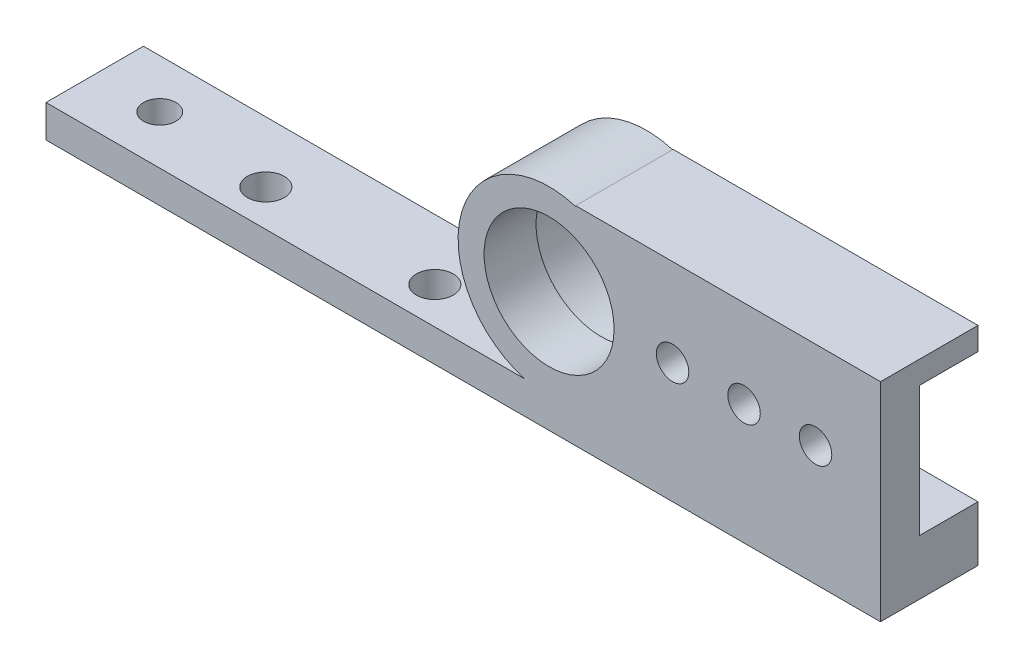
ISO-10303-21;
HEADER;
FILE_DESCRIPTION(('STEP AP214'),'2;1');
FILE_NAME('part.step','',(''),(''),'','','');
FILE_SCHEMA(('AUTOMOTIVE_DESIGN { 1 0 10303 214 1 1 1 1 }'));
ENDSEC;
DATA;
#1=APPLICATION_CONTEXT('core data for automotive mechanical design processes');
#2=APPLICATION_PROTOCOL_DEFINITION('international standard','automotive_design',2000,#1);
#3=PRODUCT_CONTEXT('',#1,'mechanical');
#4=PRODUCT('Part','Part','',(#3));
#5=PRODUCT_RELATED_PRODUCT_CATEGORY('part','',(#4));
#6=PRODUCT_DEFINITION_FORMATION('','',#4);
#7=PRODUCT_DEFINITION_CONTEXT('part definition',#1,'design');
#8=PRODUCT_DEFINITION('design','',#6,#7);
#9=PRODUCT_DEFINITION_SHAPE('','',#8);
#10=(LENGTH_UNIT() NAMED_UNIT(*) SI_UNIT(.MILLI.,.METRE.));
#11=(NAMED_UNIT(*) PLANE_ANGLE_UNIT() SI_UNIT($,.RADIAN.));
#12=(NAMED_UNIT(*) SI_UNIT($,.STERADIAN.) SOLID_ANGLE_UNIT());
#13=UNCERTAINTY_MEASURE_WITH_UNIT(LENGTH_MEASURE(1.E-05),#10,'distance_accuracy_value','');
#14=(GEOMETRIC_REPRESENTATION_CONTEXT(3) GLOBAL_UNCERTAINTY_ASSIGNED_CONTEXT((#13)) GLOBAL_UNIT_ASSIGNED_CONTEXT((#10,
#11,#12)) REPRESENTATION_CONTEXT('',''));
#15=CARTESIAN_POINT('',(0.,0.,0.));
#16=DIRECTION('',(0.,0.,1.));
#17=DIRECTION('',(1.,0.,0.));
#18=AXIS2_PLACEMENT_3D('',#15,#16,#17);
#19=CARTESIAN_POINT('',(-31.,0.,-9.));
#20=DIRECTION('',(0.,0.,1.));
#21=DIRECTION('',(1.,0.,0.));
#22=AXIS2_PLACEMENT_3D('',#19,#20,#21);
#23=CYLINDRICAL_SURFACE('',#22,14.);
#24=DIRECTION('',(0.,0.,1.));
#25=VECTOR('',#24,1.);
#26=CARTESIAN_POINT('',(-34.7080992435478,-13.5,-9.));
#27=LINE('',#26,#25);
#28=CARTESIAN_POINT('',(-34.7080992435478,-13.5,6.));
#29=VERTEX_POINT('',#28);
#30=CARTESIAN_POINT('',(-34.7080992435478,-13.5,-9.));
#31=VERTEX_POINT('',#30);
#32=EDGE_CURVE('E162',#29,#31,#27,.F.);
#33=ORIENTED_EDGE('',*,*,#32,.F.);
#34=CARTESIAN_POINT('',(-31.,0.,6.));
#35=DIRECTION('',(0.,0.,1.));
#36=DIRECTION('',(1.,0.,0.));
#37=AXIS2_PLACEMENT_3D('',#34,#35,#36);
#38=CIRCLE('',#37,14.);
#39=CARTESIAN_POINT('',(-26.8939671408107,13.3843376436512,6.));
#40=VERTEX_POINT('',#39);
#41=EDGE_CURVE('E181',#40,#29,#38,.T.);
#42=ORIENTED_EDGE('',*,*,#41,.F.);
#43=DIRECTION('',(0.,0.,1.));
#44=VECTOR('',#43,1.);
#45=CARTESIAN_POINT('',(-26.8939671408107,13.3843376436512,-9.));
#46=LINE('',#45,#44);
#47=CARTESIAN_POINT('',(-26.8939671408107,13.3843376436512,-9.));
#48=VERTEX_POINT('',#47);
#49=EDGE_CURVE('E226',#48,#40,#46,.T.);
#50=ORIENTED_EDGE('',*,*,#49,.F.);
#51=CARTESIAN_POINT('',(-31.,0.,-9.));
#52=DIRECTION('',(0.,0.,1.));
#53=DIRECTION('',(1.,0.,0.));
#54=AXIS2_PLACEMENT_3D('',#51,#52,#53);
#55=CIRCLE('',#54,14.);
#56=EDGE_CURVE('E197',#48,#31,#55,.T.);
#57=ORIENTED_EDGE('',*,*,#56,.T.);
#58=EDGE_LOOP('',(#33,#42,#50,#57));
#59=FACE_BOUND('',#58,.T.);
#60=ADVANCED_FACE('F45',(#59),#23,.T.);
#61=CARTESIAN_POINT('',(-31.,0.,-9.));
#62=DIRECTION('',(0.,0.,1.));
#63=DIRECTION('',(1.,0.,0.));
#64=AXIS2_PLACEMENT_3D('',#61,#62,#63);
#65=CYLINDRICAL_SURFACE('',#64,11.);
#66=CARTESIAN_POINT('',(-31.,0.,-9.));
#67=DIRECTION('',(0.,0.,1.));
#68=DIRECTION('',(1.,0.,0.));
#69=AXIS2_PLACEMENT_3D('',#66,#67,#68);
#70=CIRCLE('',#69,11.);
#71=CARTESIAN_POINT('',(-20.,0.,-9.));
#72=VERTEX_POINT('',#71);
#73=EDGE_CURVE('E177',#72,#72,#70,.T.);
#74=ORIENTED_EDGE('',*,*,#73,.F.);
#75=EDGE_LOOP('',(#74));
#76=FACE_BOUND('',#75,.T.);
#77=CARTESIAN_POINT('',(-31.,0.,-2.));
#78=DIRECTION('',(0.,0.,1.));
#79=DIRECTION('',(1.,0.,0.));
#80=AXIS2_PLACEMENT_3D('',#77,#78,#79);
#81=CIRCLE('',#80,11.);
#82=CARTESIAN_POINT('',(-20.,0.,-2.));
#83=VERTEX_POINT('',#82);
#84=EDGE_CURVE('E11',#83,#83,#81,.F.);
#85=ORIENTED_EDGE('',*,*,#84,.F.);
#86=EDGE_LOOP('',(#85));
#87=FACE_BOUND('',#86,.T.);
#88=ADVANCED_FACE('F323',(#76,#87),#65,.F.);
#89=CARTESIAN_POINT('',(20.,-10.,6.));
#90=DIRECTION('',(-1.,0.,0.));
#91=DIRECTION('',(0.,0.,1.));
#92=AXIS2_PLACEMENT_3D('',#89,#90,#91);
#93=PLANE('',#92);
#94=DIRECTION('',(0.,1.,0.));
#95=VECTOR('',#94,1.);
#96=CARTESIAN_POINT('',(20.,-10.,0.));
#97=LINE('',#96,#95);
#98=CARTESIAN_POINT('',(20.,-10.,0.));
#99=VERTEX_POINT('',#98);
#100=CARTESIAN_POINT('',(20.,10.,0.));
#101=VERTEX_POINT('',#100);
#102=EDGE_CURVE('E268',#99,#101,#97,.T.);
#103=ORIENTED_EDGE('',*,*,#102,.T.);
#104=DIRECTION('',(0.,0.,1.));
#105=VECTOR('',#104,1.);
#106=CARTESIAN_POINT('',(20.,10.,-9.));
#107=LINE('',#106,#105);
#108=CARTESIAN_POINT('',(20.,10.,-9.));
#109=VERTEX_POINT('',#108);
#110=EDGE_CURVE('E233',#109,#101,#107,.T.);
#111=ORIENTED_EDGE('',*,*,#110,.F.);
#112=DIRECTION('',(0.,-1.,0.));
#113=VECTOR('',#112,1.);
#114=CARTESIAN_POINT('',(20.,0.,-9.));
#115=LINE('',#114,#113);
#116=CARTESIAN_POINT('',(20.,13.5,-9.));
#117=VERTEX_POINT('',#116);
#118=EDGE_CURVE('E189',#117,#109,#115,.T.);
#119=ORIENTED_EDGE('',*,*,#118,.F.);
#120=DIRECTION('',(0.,0.,1.));
#121=VECTOR('',#120,1.);
#122=CARTESIAN_POINT('',(20.,13.5,-9.));
#123=LINE('',#122,#121);
#124=CARTESIAN_POINT('',(20.,13.5,6.));
#125=VERTEX_POINT('',#124);
#126=EDGE_CURVE('E230',#117,#125,#123,.T.);
#127=ORIENTED_EDGE('',*,*,#126,.T.);
#128=DIRECTION('',(0.,1.,0.));
#129=VECTOR('',#128,1.);
#130=CARTESIAN_POINT('',(20.,-10.,6.));
#131=LINE('',#130,#129);
#132=CARTESIAN_POINT('',(20.,-18.5,6.));
#133=VERTEX_POINT('',#132);
#134=EDGE_CURVE('E259',#133,#125,#131,.T.);
#135=ORIENTED_EDGE('',*,*,#134,.F.);
#136=DIRECTION('',(0.,0.,-1.));
#137=VECTOR('',#136,1.);
#138=CARTESIAN_POINT('',(20.,-18.5,-9.));
#139=LINE('',#138,#137);
#140=CARTESIAN_POINT('',(20.,-18.5,-9.));
#141=VERTEX_POINT('',#140);
#142=EDGE_CURVE('E155',#133,#141,#139,.T.);
#143=ORIENTED_EDGE('',*,*,#142,.T.);
#144=DIRECTION('',(0.,-1.,0.));
#145=VECTOR('',#144,1.);
#146=CARTESIAN_POINT('',(20.,0.,-9.));
#147=LINE('',#146,#145);
#148=CARTESIAN_POINT('',(20.,-10.,-9.));
#149=VERTEX_POINT('',#148);
#150=EDGE_CURVE('E200',#149,#141,#147,.T.);
#151=ORIENTED_EDGE('',*,*,#150,.F.);
#152=DIRECTION('',(0.,0.,1.));
#153=VECTOR('',#152,1.);
#154=CARTESIAN_POINT('',(20.,-10.,-9.));
#155=LINE('',#154,#153);
#156=EDGE_CURVE('E223',#149,#99,#155,.T.);
#157=ORIENTED_EDGE('',*,*,#156,.T.);
#158=EDGE_LOOP('',(#103,#111,#119,#127,#135,#143,#151,#157));
#159=FACE_BOUND('',#158,.T.);
#160=ADVANCED_FACE('F47',(#159),#93,.F.);
#161=CARTESIAN_POINT('',(0.,0.,6.));
#162=DIRECTION('',(0.,0.,1.));
#163=DIRECTION('',(1.,0.,0.));
#164=AXIS2_PLACEMENT_3D('',#161,#162,#163);
#165=PLANE('',#164);
#166=DIRECTION('',(0.,1.,0.));
#167=VECTOR('',#166,1.);
#168=CARTESIAN_POINT('',(-108.407697651309,0.,6.));
#169=LINE('',#168,#167);
#170=CARTESIAN_POINT('',(-108.407697651309,-18.5,5.99999999999999));
#171=VERTEX_POINT('',#170);
#172=CARTESIAN_POINT('',(-108.407697651309,-13.5,6.));
#173=VERTEX_POINT('',#172);
#174=EDGE_CURVE('E142',#171,#173,#169,.T.);
#175=ORIENTED_EDGE('',*,*,#174,.F.);
#176=DIRECTION('',(1.,0.,0.));
#177=VECTOR('',#176,1.);
#178=CARTESIAN_POINT('',(-180.,-18.5,6.));
#179=LINE('',#178,#177);
#180=EDGE_CURVE('E152',#171,#133,#179,.T.);
#181=ORIENTED_EDGE('',*,*,#180,.T.);
#182=ORIENTED_EDGE('',*,*,#134,.T.);
#183=DIRECTION('',(-1.,0.,0.));
#184=VECTOR('',#183,1.);
#185=CARTESIAN_POINT('',(0.,13.5,6.));
#186=LINE('',#185,#184);
#187=CARTESIAN_POINT('',(-26.8939671408107,13.5,6.));
#188=VERTEX_POINT('',#187);
#189=EDGE_CURVE('E174',#125,#188,#186,.T.);
#190=ORIENTED_EDGE('',*,*,#189,.T.);
#191=DIRECTION('',(0.,1.,0.));
#192=VECTOR('',#191,1.);
#193=CARTESIAN_POINT('',(-26.8939671408107,0.,6.));
#194=LINE('',#193,#192);
#195=EDGE_CURVE('E212',#40,#188,#194,.T.);
#196=ORIENTED_EDGE('',*,*,#195,.F.);
#197=ORIENTED_EDGE('',*,*,#41,.T.);
#198=DIRECTION('',(1.,0.,0.));
#199=VECTOR('',#198,1.);
#200=CARTESIAN_POINT('',(-180.,-13.5,6.));
#201=LINE('',#200,#199);
#202=EDGE_CURVE('E68',#173,#29,#201,.T.);
#203=ORIENTED_EDGE('',*,*,#202,.F.);
#204=EDGE_LOOP('',(#175,#181,#182,#190,#196,#197,#203));
#205=FACE_BOUND('',#204,.T.);
#206=CARTESIAN_POINT('',(10.,0.,6.));
#207=DIRECTION('',(0.,0.,1.));
#208=DIRECTION('',(1.,0.,0.));
#209=AXIS2_PLACEMENT_3D('',#206,#207,#208);
#210=CIRCLE('',#209,2.5);
#211=CARTESIAN_POINT('',(12.5,0.,6.));
#212=VERTEX_POINT('',#211);
#213=EDGE_CURVE('E245',#212,#212,#210,.T.);
#214=ORIENTED_EDGE('',*,*,#213,.F.);
#215=EDGE_LOOP('',(#214));
#216=FACE_BOUND('',#215,.T.);
#217=CARTESIAN_POINT('',(-0.999999999999999,0.,6.));
#218=DIRECTION('',(0.,0.,1.));
#219=DIRECTION('',(1.,0.,0.));
#220=AXIS2_PLACEMENT_3D('',#217,#218,#219);
#221=CIRCLE('',#220,2.5);
#222=CARTESIAN_POINT('',(1.5,0.,6.));
#223=VERTEX_POINT('',#222);
#224=EDGE_CURVE('E248',#223,#223,#221,.T.);
#225=ORIENTED_EDGE('',*,*,#224,.F.);
#226=EDGE_LOOP('',(#225));
#227=FACE_BOUND('',#226,.T.);
#228=CARTESIAN_POINT('',(-12.,-1.53625178909098E-13,6.));
#229=DIRECTION('',(0.,0.,1.));
#230=DIRECTION('',(1.,0.,0.));
#231=AXIS2_PLACEMENT_3D('',#228,#229,#230);
#232=CIRCLE('',#231,2.5);
#233=CARTESIAN_POINT('',(-9.5,-1.53625178909098E-13,6.));
#234=VERTEX_POINT('',#233);
#235=EDGE_CURVE('E254',#234,#234,#232,.T.);
#236=ORIENTED_EDGE('',*,*,#235,.F.);
#237=EDGE_LOOP('',(#236));
#238=FACE_BOUND('',#237,.T.);
#239=CARTESIAN_POINT('',(-31.,0.,6.));
#240=DIRECTION('',(0.,0.,1.));
#241=DIRECTION('',(1.,0.,0.));
#242=AXIS2_PLACEMENT_3D('',#239,#240,#241);
#243=CIRCLE('',#242,10.);
#244=CARTESIAN_POINT('',(-21.,0.,6.));
#245=VERTEX_POINT('',#244);
#246=EDGE_CURVE('E170',#245,#245,#243,.T.);
#247=ORIENTED_EDGE('',*,*,#246,.F.);
#248=EDGE_LOOP('',(#247));
#249=FACE_BOUND('',#248,.T.);
#250=ADVANCED_FACE('F150',(#205,#216,#227,#238,#249),#165,.T.);
#251=CARTESIAN_POINT('',(0.,0.,0.));
#252=DIRECTION('',(0.,0.,1.));
#253=DIRECTION('',(1.,0.,0.));
#254=AXIS2_PLACEMENT_3D('',#251,#252,#253);
#255=PLANE('',#254);
#256=CARTESIAN_POINT('',(10.,0.,0.));
#257=DIRECTION('',(0.,0.,1.));
#258=DIRECTION('',(1.,0.,0.));
#259=AXIS2_PLACEMENT_3D('',#256,#257,#258);
#260=CIRCLE('',#259,2.5);
#261=CARTESIAN_POINT('',(12.5,0.,0.));
#262=VERTEX_POINT('',#261);
#263=EDGE_CURVE('E241',#262,#262,#260,.T.);
#264=ORIENTED_EDGE('',*,*,#263,.T.);
#265=EDGE_LOOP('',(#264));
#266=FACE_BOUND('',#265,.T.);
#267=CARTESIAN_POINT('',(-0.999999999999999,0.,0.));
#268=DIRECTION('',(0.,0.,1.));
#269=DIRECTION('',(1.,0.,0.));
#270=AXIS2_PLACEMENT_3D('',#267,#268,#269);
#271=CIRCLE('',#270,2.5);
#272=CARTESIAN_POINT('',(1.5,0.,0.));
#273=VERTEX_POINT('',#272);
#274=EDGE_CURVE('E251',#273,#273,#271,.T.);
#275=ORIENTED_EDGE('',*,*,#274,.T.);
#276=EDGE_LOOP('',(#275));
#277=FACE_BOUND('',#276,.T.);
#278=CARTESIAN_POINT('',(-12.,-1.53625178909098E-13,0.));
#279=DIRECTION('',(0.,0.,1.));
#280=DIRECTION('',(1.,0.,0.));
#281=AXIS2_PLACEMENT_3D('',#278,#279,#280);
#282=CIRCLE('',#281,2.5);
#283=CARTESIAN_POINT('',(-9.5,-1.53625178909098E-13,0.));
#284=VERTEX_POINT('',#283);
#285=EDGE_CURVE('E219',#284,#284,#282,.T.);
#286=ORIENTED_EDGE('',*,*,#285,.T.);
#287=EDGE_LOOP('',(#286));
#288=FACE_BOUND('',#287,.T.);
#289=DIRECTION('',(0.,-1.,0.));
#290=VECTOR('',#289,1.);
#291=CARTESIAN_POINT('',(-20.,-10.,0.));
#292=LINE('',#291,#290);
#293=CARTESIAN_POINT('',(-20.,-8.66025403784439,0.));
#294=VERTEX_POINT('',#293);
#295=CARTESIAN_POINT('',(-20.,-10.,0.));
#296=VERTEX_POINT('',#295);
#297=EDGE_CURVE('E244',#294,#296,#292,.T.);
#298=ORIENTED_EDGE('',*,*,#297,.F.);
#299=CARTESIAN_POINT('',(-31.,0.,0.));
#300=DIRECTION('',(0.,0.,1.));
#301=DIRECTION('',(1.,0.,0.));
#302=AXIS2_PLACEMENT_3D('',#299,#300,#301);
#303=CIRCLE('',#302,14.);
#304=CARTESIAN_POINT('',(-20.,8.66025403784439,0.));
#305=VERTEX_POINT('',#304);
#306=EDGE_CURVE('E53',#294,#305,#303,.T.);
#307=ORIENTED_EDGE('',*,*,#306,.T.);
#308=CARTESIAN_POINT('',(-20.,10.,0.));
#309=VERTEX_POINT('',#308);
#310=EDGE_CURVE('E262',#309,#305,#292,.T.);
#311=ORIENTED_EDGE('',*,*,#310,.F.);
#312=DIRECTION('',(-1.,0.,0.));
#313=VECTOR('',#312,1.);
#314=CARTESIAN_POINT('',(20.,10.,0.));
#315=LINE('',#314,#313);
#316=EDGE_CURVE('E261',#101,#309,#315,.T.);
#317=ORIENTED_EDGE('',*,*,#316,.F.);
#318=ORIENTED_EDGE('',*,*,#102,.F.);
#319=DIRECTION('',(1.,0.,0.));
#320=VECTOR('',#319,1.);
#321=CARTESIAN_POINT('',(20.,-10.,0.));
#322=LINE('',#321,#320);
#323=EDGE_CURVE('E265',#296,#99,#322,.T.);
#324=ORIENTED_EDGE('',*,*,#323,.F.);
#325=EDGE_LOOP('',(#298,#307,#311,#317,#318,#324));
#326=FACE_BOUND('',#325,.T.);
#327=ADVANCED_FACE('F273',(#266,#277,#288,#326),#255,.F.);
#328=CARTESIAN_POINT('',(-12.,-1.53625178909098E-13,0.));
#329=DIRECTION('',(0.,0.,1.));
#330=DIRECTION('',(1.,0.,0.));
#331=AXIS2_PLACEMENT_3D('',#328,#329,#330);
#332=CYLINDRICAL_SURFACE('',#331,2.5);
#333=ORIENTED_EDGE('',*,*,#285,.F.);
#334=EDGE_LOOP('',(#333));
#335=FACE_BOUND('',#334,.T.);
#336=ORIENTED_EDGE('',*,*,#235,.T.);
#337=EDGE_LOOP('',(#336));
#338=FACE_BOUND('',#337,.T.);
#339=ADVANCED_FACE('F529',(#335,#338),#332,.F.);
#340=CARTESIAN_POINT('',(-0.999999999999999,0.,0.));
#341=DIRECTION('',(0.,0.,1.));
#342=DIRECTION('',(1.,0.,0.));
#343=AXIS2_PLACEMENT_3D('',#340,#341,#342);
#344=CYLINDRICAL_SURFACE('',#343,2.5);
#345=ORIENTED_EDGE('',*,*,#274,.F.);
#346=EDGE_LOOP('',(#345));
#347=FACE_BOUND('',#346,.T.);
#348=ORIENTED_EDGE('',*,*,#224,.T.);
#349=EDGE_LOOP('',(#348));
#350=FACE_BOUND('',#349,.T.);
#351=ADVANCED_FACE('F541',(#347,#350),#344,.F.);
#352=CARTESIAN_POINT('',(10.,0.,0.));
#353=DIRECTION('',(0.,0.,1.));
#354=DIRECTION('',(1.,0.,0.));
#355=AXIS2_PLACEMENT_3D('',#352,#353,#354);
#356=CYLINDRICAL_SURFACE('',#355,2.5);
#357=ORIENTED_EDGE('',*,*,#263,.F.);
#358=EDGE_LOOP('',(#357));
#359=FACE_BOUND('',#358,.T.);
#360=ORIENTED_EDGE('',*,*,#213,.T.);
#361=EDGE_LOOP('',(#360));
#362=FACE_BOUND('',#361,.T.);
#363=ADVANCED_FACE('F518',(#359,#362),#356,.F.);
#364=CARTESIAN_POINT('',(-31.,0.,-9.));
#365=DIRECTION('',(0.,0.,1.));
#366=DIRECTION('',(1.,0.,0.));
#367=AXIS2_PLACEMENT_3D('',#364,#365,#366);
#368=CYLINDRICAL_SURFACE('',#367,14.);
#369=ORIENTED_EDGE('',*,*,#306,.F.);
#370=DIRECTION('',(0.,0.,1.));
#371=VECTOR('',#370,1.);
#372=CARTESIAN_POINT('',(-20.,-8.66025403784439,-9.));
#373=LINE('',#372,#371);
#374=CARTESIAN_POINT('',(-20.,-8.66025403784439,-9.));
#375=VERTEX_POINT('',#374);
#376=EDGE_CURVE('E216',#375,#294,#373,.T.);
#377=ORIENTED_EDGE('',*,*,#376,.F.);
#378=CARTESIAN_POINT('',(-31.,0.,-9.));
#379=DIRECTION('',(0.,0.,1.));
#380=DIRECTION('',(1.,0.,0.));
#381=AXIS2_PLACEMENT_3D('',#378,#379,#380);
#382=CIRCLE('',#381,14.);
#383=CARTESIAN_POINT('',(-20.,8.66025403784439,-9.));
#384=VERTEX_POINT('',#383);
#385=EDGE_CURVE('E180',#375,#384,#382,.T.);
#386=ORIENTED_EDGE('',*,*,#385,.T.);
#387=DIRECTION('',(0.,0.,1.));
#388=VECTOR('',#387,1.);
#389=CARTESIAN_POINT('',(-20.,8.66025403784439,-9.));
#390=LINE('',#389,#388);
#391=EDGE_CURVE('E209',#384,#305,#390,.T.);
#392=ORIENTED_EDGE('',*,*,#391,.T.);
#393=EDGE_LOOP('',(#369,#377,#386,#392));
#394=FACE_BOUND('',#393,.T.);
#395=ADVANCED_FACE('F281',(#394),#368,.T.);
#396=CARTESIAN_POINT('',(-20.,0.,-9.));
#397=DIRECTION('',(-1.,0.,0.));
#398=DIRECTION('',(0.,0.,1.));
#399=AXIS2_PLACEMENT_3D('',#396,#397,#398);
#400=PLANE('',#399);
#401=ORIENTED_EDGE('',*,*,#376,.T.);
#402=ORIENTED_EDGE('',*,*,#297,.T.);
#403=DIRECTION('',(0.,0.,1.));
#404=VECTOR('',#403,1.);
#405=CARTESIAN_POINT('',(-20.,-10.,-9.));
#406=LINE('',#405,#404);
#407=CARTESIAN_POINT('',(-20.,-10.,-9.));
#408=VERTEX_POINT('',#407);
#409=EDGE_CURVE('E220',#408,#296,#406,.T.);
#410=ORIENTED_EDGE('',*,*,#409,.F.);
#411=DIRECTION('',(0.,-1.,0.));
#412=VECTOR('',#411,1.);
#413=CARTESIAN_POINT('',(-20.,0.,-9.));
#414=LINE('',#413,#412);
#415=EDGE_CURVE('E206',#375,#408,#414,.T.);
#416=ORIENTED_EDGE('',*,*,#415,.F.);
#417=EDGE_LOOP('',(#401,#402,#410,#416));
#418=FACE_BOUND('',#417,.T.);
#419=ADVANCED_FACE('F335',(#418),#400,.F.);
#420=CARTESIAN_POINT('',(0.,-10.,-9.));
#421=DIRECTION('',(0.,-1.,0.));
#422=DIRECTION('',(1.,0.,0.));
#423=AXIS2_PLACEMENT_3D('',#420,#421,#422);
#424=PLANE('',#423);
#425=ORIENTED_EDGE('',*,*,#409,.T.);
#426=ORIENTED_EDGE('',*,*,#323,.T.);
#427=ORIENTED_EDGE('',*,*,#156,.F.);
#428=DIRECTION('',(1.,0.,0.));
#429=VECTOR('',#428,1.);
#430=CARTESIAN_POINT('',(0.,-10.,-9.));
#431=LINE('',#430,#429);
#432=EDGE_CURVE('E203',#408,#149,#431,.T.);
#433=ORIENTED_EDGE('',*,*,#432,.F.);
#434=EDGE_LOOP('',(#425,#426,#427,#433));
#435=FACE_BOUND('',#434,.T.);
#436=ADVANCED_FACE('F295',(#435),#424,.F.);
#437=CARTESIAN_POINT('',(0.,10.,-9.));
#438=DIRECTION('',(0.,1.,0.));
#439=DIRECTION('',(-1.,0.,0.));
#440=AXIS2_PLACEMENT_3D('',#437,#438,#439);
#441=PLANE('',#440);
#442=ORIENTED_EDGE('',*,*,#110,.T.);
#443=ORIENTED_EDGE('',*,*,#316,.T.);
#444=DIRECTION('',(0.,0.,1.));
#445=VECTOR('',#444,1.);
#446=CARTESIAN_POINT('',(-20.,10.,-9.));
#447=LINE('',#446,#445);
#448=CARTESIAN_POINT('',(-20.,10.,-9.));
#449=VERTEX_POINT('',#448);
#450=EDGE_CURVE('E236',#449,#309,#447,.T.);
#451=ORIENTED_EDGE('',*,*,#450,.F.);
#452=DIRECTION('',(-1.,0.,0.));
#453=VECTOR('',#452,1.);
#454=CARTESIAN_POINT('',(0.,10.,-9.));
#455=LINE('',#454,#453);
#456=EDGE_CURVE('E186',#109,#449,#455,.T.);
#457=ORIENTED_EDGE('',*,*,#456,.F.);
#458=EDGE_LOOP('',(#442,#443,#451,#457));
#459=FACE_BOUND('',#458,.T.);
#460=ADVANCED_FACE('F291',(#459),#441,.F.);
#461=CARTESIAN_POINT('',(-20.,0.,-9.));
#462=DIRECTION('',(-1.,0.,0.));
#463=DIRECTION('',(0.,0.,1.));
#464=AXIS2_PLACEMENT_3D('',#461,#462,#463);
#465=PLANE('',#464);
#466=ORIENTED_EDGE('',*,*,#450,.T.);
#467=ORIENTED_EDGE('',*,*,#310,.T.);
#468=ORIENTED_EDGE('',*,*,#391,.F.);
#469=DIRECTION('',(0.,-1.,0.));
#470=VECTOR('',#469,1.);
#471=CARTESIAN_POINT('',(-20.,0.,-9.));
#472=LINE('',#471,#470);
#473=EDGE_CURVE('E184',#449,#384,#472,.T.);
#474=ORIENTED_EDGE('',*,*,#473,.F.);
#475=EDGE_LOOP('',(#466,#467,#468,#474));
#476=FACE_BOUND('',#475,.T.);
#477=ADVANCED_FACE('F279',(#476),#465,.F.);
#478=CARTESIAN_POINT('',(-26.8939671408107,0.,-9.));
#479=DIRECTION('',(1.,0.,0.));
#480=DIRECTION('',(0.,0.,-1.));
#481=AXIS2_PLACEMENT_3D('',#478,#479,#480);
#482=PLANE('',#481);
#483=ORIENTED_EDGE('',*,*,#195,.T.);
#484=DIRECTION('',(0.,0.,1.));
#485=VECTOR('',#484,1.);
#486=CARTESIAN_POINT('',(-26.8939671408107,13.5,-9.));
#487=LINE('',#486,#485);
#488=CARTESIAN_POINT('',(-26.8939671408107,13.5,-9.));
#489=VERTEX_POINT('',#488);
#490=EDGE_CURVE('E228',#489,#188,#487,.T.);
#491=ORIENTED_EDGE('',*,*,#490,.F.);
#492=DIRECTION('',(0.,1.,0.));
#493=VECTOR('',#492,1.);
#494=CARTESIAN_POINT('',(-26.8939671408107,0.,-9.));
#495=LINE('',#494,#493);
#496=EDGE_CURVE('E195',#48,#489,#495,.T.);
#497=ORIENTED_EDGE('',*,*,#496,.F.);
#498=ORIENTED_EDGE('',*,*,#49,.T.);
#499=EDGE_LOOP('',(#483,#491,#497,#498));
#500=FACE_BOUND('',#499,.T.);
#501=ADVANCED_FACE('F306',(#500),#482,.F.);
#502=CARTESIAN_POINT('',(0.,13.5,-9.));
#503=DIRECTION('',(0.,1.,0.));
#504=DIRECTION('',(-1.,0.,0.));
#505=AXIS2_PLACEMENT_3D('',#502,#503,#504);
#506=PLANE('',#505);
#507=ORIENTED_EDGE('',*,*,#189,.F.);
#508=ORIENTED_EDGE('',*,*,#126,.F.);
#509=DIRECTION('',(-1.,0.,0.));
#510=VECTOR('',#509,1.);
#511=CARTESIAN_POINT('',(0.,13.5,-9.));
#512=LINE('',#511,#510);
#513=EDGE_CURVE('E192',#117,#489,#512,.T.);
#514=ORIENTED_EDGE('',*,*,#513,.T.);
#515=ORIENTED_EDGE('',*,*,#490,.T.);
#516=EDGE_LOOP('',(#507,#508,#514,#515));
#517=FACE_BOUND('',#516,.T.);
#518=ADVANCED_FACE('F309',(#517),#506,.T.);
#519=CARTESIAN_POINT('',(0.,0.,-9.));
#520=DIRECTION('',(0.,0.,1.));
#521=DIRECTION('',(1.,0.,0.));
#522=AXIS2_PLACEMENT_3D('',#519,#520,#521);
#523=PLANE('',#522);
#524=ORIENTED_EDGE('',*,*,#73,.T.);
#525=EDGE_LOOP('',(#524));
#526=FACE_BOUND('',#525,.T.);
#527=DIRECTION('',(1.,0.,0.));
#528=VECTOR('',#527,1.);
#529=CARTESIAN_POINT('',(-180.,-18.5,-9.));
#530=LINE('',#529,#528);
#531=CARTESIAN_POINT('',(-108.407697651309,-18.5,-9.));
#532=VERTEX_POINT('',#531);
#533=EDGE_CURVE('E160',#532,#141,#530,.T.);
#534=ORIENTED_EDGE('',*,*,#533,.F.);
#535=DIRECTION('',(0.,1.,0.));
#536=VECTOR('',#535,1.);
#537=CARTESIAN_POINT('',(-108.407697651309,0.,-9.));
#538=LINE('',#537,#536);
#539=CARTESIAN_POINT('',(-108.407697651309,-13.5,-9.));
#540=VERTEX_POINT('',#539);
#541=EDGE_CURVE('E60',#532,#540,#538,.T.);
#542=ORIENTED_EDGE('',*,*,#541,.T.);
#543=DIRECTION('',(1.,0.,0.));
#544=VECTOR('',#543,1.);
#545=CARTESIAN_POINT('',(-180.,-13.5,-9.));
#546=LINE('',#545,#544);
#547=EDGE_CURVE('E164',#540,#31,#546,.T.);
#548=ORIENTED_EDGE('',*,*,#547,.T.);
#549=ORIENTED_EDGE('',*,*,#56,.F.);
#550=ORIENTED_EDGE('',*,*,#496,.T.);
#551=ORIENTED_EDGE('',*,*,#513,.F.);
#552=ORIENTED_EDGE('',*,*,#118,.T.);
#553=ORIENTED_EDGE('',*,*,#456,.T.);
#554=ORIENTED_EDGE('',*,*,#473,.T.);
#555=ORIENTED_EDGE('',*,*,#385,.F.);
#556=ORIENTED_EDGE('',*,*,#415,.T.);
#557=ORIENTED_EDGE('',*,*,#432,.T.);
#558=ORIENTED_EDGE('',*,*,#150,.T.);
#559=EDGE_LOOP('',(#534,#542,#548,#549,#550,#551,#552,#553,#554,#555,#556,#557,#558));
#560=FACE_BOUND('',#559,.T.);
#561=ADVANCED_FACE('F285',(#526,#560),#523,.F.);
#562=CARTESIAN_POINT('',(-31.,0.,-2.));
#563=DIRECTION('',(0.,0.,1.));
#564=DIRECTION('',(1.,0.,0.));
#565=AXIS2_PLACEMENT_3D('',#562,#563,#564);
#566=PLANE('',#565);
#567=CARTESIAN_POINT('',(-31.,0.,-2.));
#568=DIRECTION('',(0.,0.,1.));
#569=DIRECTION('',(1.,0.,0.));
#570=AXIS2_PLACEMENT_3D('',#567,#568,#569);
#571=CIRCLE('',#570,10.);
#572=CARTESIAN_POINT('',(-21.,0.,-2.));
#573=VERTEX_POINT('',#572);
#574=EDGE_CURVE('E171',#573,#573,#571,.T.);
#575=ORIENTED_EDGE('',*,*,#574,.T.);
#576=EDGE_LOOP('',(#575));
#577=FACE_BOUND('',#576,.T.);
#578=ORIENTED_EDGE('',*,*,#84,.T.);
#579=EDGE_LOOP('',(#578));
#580=FACE_BOUND('',#579,.T.);
#581=ADVANCED_FACE('F317',(#577,#580),#566,.F.);
#582=CARTESIAN_POINT('',(-31.,0.,-2.));
#583=DIRECTION('',(0.,0.,1.));
#584=DIRECTION('',(1.,0.,0.));
#585=AXIS2_PLACEMENT_3D('',#582,#583,#584);
#586=CYLINDRICAL_SURFACE('',#585,10.);
#587=ORIENTED_EDGE('',*,*,#574,.F.);
#588=EDGE_LOOP('',(#587));
#589=FACE_BOUND('',#588,.T.);
#590=ORIENTED_EDGE('',*,*,#246,.T.);
#591=EDGE_LOOP('',(#590));
#592=FACE_BOUND('',#591,.T.);
#593=ADVANCED_FACE('F340',(#589,#592),#586,.F.);
#594=CARTESIAN_POINT('',(-180.,-13.5,-9.));
#595=DIRECTION('',(0.,1.,0.));
#596=DIRECTION('',(0.,0.,1.));
#597=AXIS2_PLACEMENT_3D('',#594,#595,#596);
#598=PLANE('',#597);
#599=CARTESIAN_POINT('',(-54.236068439586,-13.5,0.343836832417843));
#600=DIRECTION('',(0.,1.,0.));
#601=DIRECTION('',(0.,0.,1.));
#602=AXIS2_PLACEMENT_3D('',#599,#600,#601);
#603=CIRCLE('',#602,2.83706985606989);
#604=CARTESIAN_POINT('',(-54.236068439586,-13.5,3.18090668848773));
#605=VERTEX_POINT('',#604);
#606=EDGE_CURVE('E369',#605,#605,#603,.T.);
#607=ORIENTED_EDGE('',*,*,#606,.F.);
#608=EDGE_LOOP('',(#607));
#609=FACE_BOUND('',#608,.T.);
#610=CARTESIAN_POINT('',(-80.236068439586,-13.5,0.343836832417843));
#611=DIRECTION('',(0.,1.,0.));
#612=DIRECTION('',(0.,0.,1.));
#613=AXIS2_PLACEMENT_3D('',#610,#611,#612);
#614=CIRCLE('',#613,2.83706985606989);
#615=CARTESIAN_POINT('',(-80.236068439586,-13.5,3.18090668848773));
#616=VERTEX_POINT('',#615);
#617=EDGE_CURVE('E373',#616,#616,#614,.T.);
#618=ORIENTED_EDGE('',*,*,#617,.F.);
#619=EDGE_LOOP('',(#618));
#620=FACE_BOUND('',#619,.T.);
#621=CARTESIAN_POINT('',(-98.407697651309,-13.5,-1.5));
#622=DIRECTION('',(0.,1.,0.));
#623=DIRECTION('',(0.,0.,1.));
#624=AXIS2_PLACEMENT_3D('',#621,#622,#623);
#625=CIRCLE('',#624,2.49999999999999);
#626=CARTESIAN_POINT('',(-98.407697651309,-13.5,0.99999999999999));
#627=VERTEX_POINT('',#626);
#628=EDGE_CURVE('E147',#627,#627,#625,.T.);
#629=ORIENTED_EDGE('',*,*,#628,.F.);
#630=EDGE_LOOP('',(#629));
#631=FACE_BOUND('',#630,.T.);
#632=DIRECTION('',(0.,0.,-1.));
#633=VECTOR('',#632,1.);
#634=CARTESIAN_POINT('',(-108.407697651309,-13.5,-9.));
#635=LINE('',#634,#633);
#636=EDGE_CURVE('E146',#173,#540,#635,.T.);
#637=ORIENTED_EDGE('',*,*,#636,.F.);
#638=ORIENTED_EDGE('',*,*,#202,.T.);
#639=ORIENTED_EDGE('',*,*,#32,.T.);
#640=ORIENTED_EDGE('',*,*,#547,.F.);
#641=EDGE_LOOP('',(#637,#638,#639,#640));
#642=FACE_BOUND('',#641,.T.);
#643=ADVANCED_FACE('F299',(#609,#620,#631,#642),#598,.T.);
#644=CARTESIAN_POINT('',(-180.,-18.5,-9.));
#645=DIRECTION('',(0.,-1.,0.));
#646=DIRECTION('',(0.,0.,-1.));
#647=AXIS2_PLACEMENT_3D('',#644,#645,#646);
#648=PLANE('',#647);
#649=CARTESIAN_POINT('',(-54.236068439586,-18.5,0.343836832417843));
#650=DIRECTION('',(0.,-1.,0.));
#651=DIRECTION('',(0.,0.,-1.));
#652=AXIS2_PLACEMENT_3D('',#649,#650,#651);
#653=CIRCLE('',#652,2.83706985606989);
#654=CARTESIAN_POINT('',(-54.236068439586,-18.5,-2.49323302365204));
#655=VERTEX_POINT('',#654);
#656=EDGE_CURVE('E372',#655,#655,#653,.T.);
#657=ORIENTED_EDGE('',*,*,#656,.F.);
#658=EDGE_LOOP('',(#657));
#659=FACE_BOUND('',#658,.T.);
#660=CARTESIAN_POINT('',(-80.236068439586,-18.5,0.343836832417843));
#661=DIRECTION('',(0.,-1.,0.));
#662=DIRECTION('',(0.,0.,-1.));
#663=AXIS2_PLACEMENT_3D('',#660,#661,#662);
#664=CIRCLE('',#663,2.83706985606989);
#665=CARTESIAN_POINT('',(-80.236068439586,-18.5,-2.49323302365204));
#666=VERTEX_POINT('',#665);
#667=EDGE_CURVE('E374',#666,#666,#664,.T.);
#668=ORIENTED_EDGE('',*,*,#667,.F.);
#669=EDGE_LOOP('',(#668));
#670=FACE_BOUND('',#669,.T.);
#671=CARTESIAN_POINT('',(-98.407697651309,-18.5,-1.5));
#672=DIRECTION('',(0.,-1.,0.));
#673=DIRECTION('',(0.,0.,-1.));
#674=AXIS2_PLACEMENT_3D('',#671,#672,#673);
#675=CIRCLE('',#674,2.49999999999999);
#676=CARTESIAN_POINT('',(-98.407697651309,-18.5,-4.));
#677=VERTEX_POINT('',#676);
#678=EDGE_CURVE('E382',#677,#677,#675,.T.);
#679=ORIENTED_EDGE('',*,*,#678,.F.);
#680=EDGE_LOOP('',(#679));
#681=FACE_BOUND('',#680,.T.);
#682=DIRECTION('',(0.,0.,1.));
#683=VECTOR('',#682,1.);
#684=CARTESIAN_POINT('',(-108.407697651309,-18.5,-17.1171016360619));
#685=LINE('',#684,#683);
#686=EDGE_CURVE('E139',#532,#171,#685,.T.);
#687=ORIENTED_EDGE('',*,*,#686,.F.);
#688=ORIENTED_EDGE('',*,*,#533,.T.);
#689=ORIENTED_EDGE('',*,*,#142,.F.);
#690=ORIENTED_EDGE('',*,*,#180,.F.);
#691=EDGE_LOOP('',(#687,#688,#689,#690));
#692=FACE_BOUND('',#691,.T.);
#693=ADVANCED_FACE('F158',(#659,#670,#681,#692),#648,.T.);
#694=CARTESIAN_POINT('',(-108.407697651309,14.,-17.1171016360619));
#695=DIRECTION('',(1.,0.,0.));
#696=DIRECTION('',(0.,0.,-1.));
#697=AXIS2_PLACEMENT_3D('',#694,#695,#696);
#698=PLANE('',#697);
#699=ORIENTED_EDGE('',*,*,#174,.T.);
#700=ORIENTED_EDGE('',*,*,#636,.T.);
#701=ORIENTED_EDGE('',*,*,#541,.F.);
#702=ORIENTED_EDGE('',*,*,#686,.T.);
#703=EDGE_LOOP('',(#699,#700,#701,#702));
#704=FACE_BOUND('',#703,.T.);
#705=ADVANCED_FACE('F141',(#704),#698,.F.);
#706=CARTESIAN_POINT('',(-98.407697651309,-8.5,-1.5));
#707=DIRECTION('',(0.,-1.,0.));
#708=DIRECTION('',(0.,0.,-1.));
#709=AXIS2_PLACEMENT_3D('',#706,#707,#708);
#710=CYLINDRICAL_SURFACE('',#709,2.49999999999999);
#711=ORIENTED_EDGE('',*,*,#628,.T.);
#712=EDGE_LOOP('',(#711));
#713=FACE_BOUND('',#712,.T.);
#714=ORIENTED_EDGE('',*,*,#678,.T.);
#715=EDGE_LOOP('',(#714));
#716=FACE_BOUND('',#715,.T.);
#717=ADVANCED_FACE('F353',(#713,#716),#710,.F.);
#718=CARTESIAN_POINT('',(-80.236068439586,-8.5,0.343836832417843));
#719=DIRECTION('',(0.,-1.,0.));
#720=DIRECTION('',(0.,0.,-1.));
#721=AXIS2_PLACEMENT_3D('',#718,#719,#720);
#722=CYLINDRICAL_SURFACE('',#721,2.83706985606989);
#723=ORIENTED_EDGE('',*,*,#617,.T.);
#724=EDGE_LOOP('',(#723));
#725=FACE_BOUND('',#724,.T.);
#726=ORIENTED_EDGE('',*,*,#667,.T.);
#727=EDGE_LOOP('',(#726));
#728=FACE_BOUND('',#727,.T.);
#729=ADVANCED_FACE('F356',(#725,#728),#722,.F.);
#730=CARTESIAN_POINT('',(-54.236068439586,-8.5,0.343836832417843));
#731=DIRECTION('',(0.,-1.,0.));
#732=DIRECTION('',(0.,0.,-1.));
#733=AXIS2_PLACEMENT_3D('',#730,#731,#732);
#734=CYLINDRICAL_SURFACE('',#733,2.83706985606989);
#735=ORIENTED_EDGE('',*,*,#606,.T.);
#736=EDGE_LOOP('',(#735));
#737=FACE_BOUND('',#736,.T.);
#738=ORIENTED_EDGE('',*,*,#656,.T.);
#739=EDGE_LOOP('',(#738));
#740=FACE_BOUND('',#739,.T.);
#741=ADVANCED_FACE('F360',(#737,#740),#734,.F.);
#742=CLOSED_SHELL('',(#60,#88,#160,#250,#327,#339,#351,#363,#395,#419,#436,#460,#477,#501,#518,
#561,#581,#593,#643,#693,#705,#717,#729,#741));
#743=MANIFOLD_SOLID_BREP('B2',#742);
#744=ADVANCED_BREP_SHAPE_REPRESENTATION('',(#18,#743),#14);
#745=SHAPE_DEFINITION_REPRESENTATION(#9,#744);
ENDSEC;
END-ISO-10303-21;
